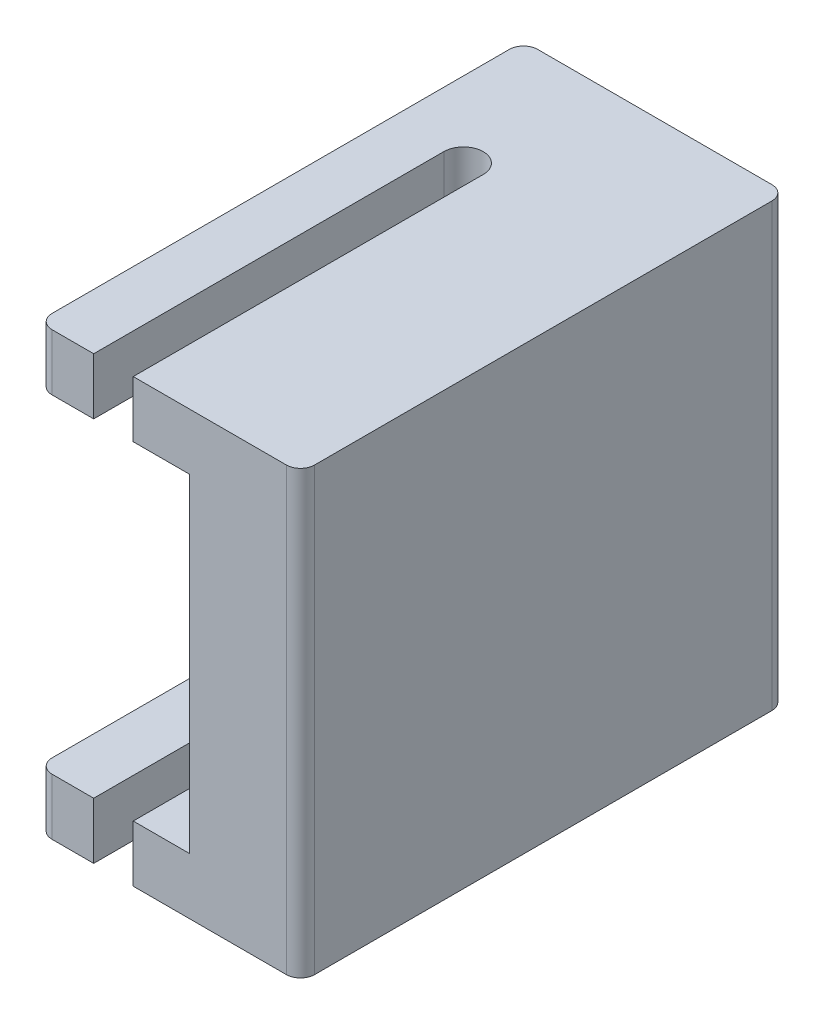
ISO-10303-21;
HEADER;
FILE_DESCRIPTION(('STEP AP214'),'2;1');
FILE_NAME('part.step','',(''),(''),'','','');
FILE_SCHEMA(('AUTOMOTIVE_DESIGN { 1 0 10303 214 1 1 1 1 }'));
ENDSEC;
DATA;
#1=APPLICATION_CONTEXT('core data for automotive mechanical design processes');
#2=APPLICATION_PROTOCOL_DEFINITION('international standard','automotive_design',2000,#1);
#3=PRODUCT_CONTEXT('',#1,'mechanical');
#4=PRODUCT('Part','Part','',(#3));
#5=PRODUCT_RELATED_PRODUCT_CATEGORY('part','',(#4));
#6=PRODUCT_DEFINITION_FORMATION('','',#4);
#7=PRODUCT_DEFINITION_CONTEXT('part definition',#1,'design');
#8=PRODUCT_DEFINITION('design','',#6,#7);
#9=PRODUCT_DEFINITION_SHAPE('','',#8);
#10=(LENGTH_UNIT() NAMED_UNIT(*) SI_UNIT(.MILLI.,.METRE.));
#11=(NAMED_UNIT(*) PLANE_ANGLE_UNIT() SI_UNIT($,.RADIAN.));
#12=(NAMED_UNIT(*) SI_UNIT($,.STERADIAN.) SOLID_ANGLE_UNIT());
#13=UNCERTAINTY_MEASURE_WITH_UNIT(LENGTH_MEASURE(1.E-05),#10,'distance_accuracy_value','');
#14=(GEOMETRIC_REPRESENTATION_CONTEXT(3) GLOBAL_UNCERTAINTY_ASSIGNED_CONTEXT((#13)) GLOBAL_UNIT_ASSIGNED_CONTEXT((#10,
#11,#12)) REPRESENTATION_CONTEXT('',''));
#15=CARTESIAN_POINT('',(0.,0.,0.));
#16=DIRECTION('',(0.,0.,1.));
#17=DIRECTION('',(1.,0.,0.));
#18=AXIS2_PLACEMENT_3D('',#15,#16,#17);
#19=CARTESIAN_POINT('',(0.,0.,43.));
#20=DIRECTION('',(0.,0.,1.));
#21=DIRECTION('',(1.,0.,0.));
#22=AXIS2_PLACEMENT_3D('',#19,#20,#21);
#23=PLANE('',#22);
#24=DIRECTION('',(-1.,0.,0.));
#25=VECTOR('',#24,1.);
#26=CARTESIAN_POINT('',(-19.625,-29.0875,43.));
#27=LINE('',#26,#25);
#28=CARTESIAN_POINT('',(-36.625,-29.0875,43.));
#29=VERTEX_POINT('',#28);
#30=CARTESIAN_POINT('',(-44.,-29.0875,43.));
#31=VERTEX_POINT('',#30);
#32=EDGE_CURVE('E260',#29,#31,#27,.T.);
#33=ORIENTED_EDGE('',*,*,#32,.T.);
#34=DIRECTION('',(0.,-1.,0.));
#35=VECTOR('',#34,1.);
#36=CARTESIAN_POINT('',(-44.,-39.0875,43.));
#37=LINE('',#36,#35);
#38=CARTESIAN_POINT('',(-44.,-39.0875,43.));
#39=VERTEX_POINT('',#38);
#40=EDGE_CURVE('E330',#31,#39,#37,.T.);
#41=ORIENTED_EDGE('',*,*,#40,.T.);
#42=DIRECTION('',(1.,0.,0.));
#43=VECTOR('',#42,1.);
#44=CARTESIAN_POINT('',(-46.5,-39.0875,43.));
#45=LINE('',#44,#43);
#46=CARTESIAN_POINT('',(-36.625,-39.0875,43.));
#47=VERTEX_POINT('',#46);
#48=EDGE_CURVE('E264',#39,#47,#45,.T.);
#49=ORIENTED_EDGE('',*,*,#48,.T.);
#50=DIRECTION('',(0.,1.,0.));
#51=VECTOR('',#50,1.);
#52=CARTESIAN_POINT('',(-36.625,-39.0875,43.));
#53=LINE('',#52,#51);
#54=EDGE_CURVE('E231',#47,#29,#53,.T.);
#55=ORIENTED_EDGE('',*,*,#54,.T.);
#56=EDGE_LOOP('',(#33,#41,#49,#55));
#57=FACE_BOUND('',#56,.T.);
#58=ADVANCED_FACE('F42',(#57),#23,.T.);
#59=DIRECTION('',(-1.,0.,0.));
#60=VECTOR('',#59,1.);
#61=CARTESIAN_POINT('',(0.,39.0875,43.));
#62=LINE('',#61,#60);
#63=CARTESIAN_POINT('',(-36.625,39.0875,43.));
#64=VERTEX_POINT('',#63);
#65=CARTESIAN_POINT('',(-44.,39.0875,43.));
#66=VERTEX_POINT('',#65);
#67=EDGE_CURVE('E255',#64,#66,#62,.T.);
#68=ORIENTED_EDGE('',*,*,#67,.T.);
#69=DIRECTION('',(0.,-1.,0.));
#70=VECTOR('',#69,1.);
#71=CARTESIAN_POINT('',(-44.,29.0875,43.));
#72=LINE('',#71,#70);
#73=CARTESIAN_POINT('',(-44.,29.0875,43.));
#74=VERTEX_POINT('',#73);
#75=EDGE_CURVE('E11',#66,#74,#72,.T.);
#76=ORIENTED_EDGE('',*,*,#75,.T.);
#77=DIRECTION('',(1.,0.,0.));
#78=VECTOR('',#77,1.);
#79=CARTESIAN_POINT('',(-46.5,29.0875,43.));
#80=LINE('',#79,#78);
#81=CARTESIAN_POINT('',(-36.625,29.0875,43.));
#82=VERTEX_POINT('',#81);
#83=EDGE_CURVE('E256',#74,#82,#80,.T.);
#84=ORIENTED_EDGE('',*,*,#83,.T.);
#85=DIRECTION('',(0.,-1.,0.));
#86=VECTOR('',#85,1.);
#87=CARTESIAN_POINT('',(-36.625,0.,43.));
#88=LINE('',#87,#86);
#89=EDGE_CURVE('E304',#64,#82,#88,.T.);
#90=ORIENTED_EDGE('',*,*,#89,.F.);
#91=EDGE_LOOP('',(#68,#76,#84,#90));
#92=FACE_BOUND('',#91,.T.);
#93=ADVANCED_FACE('F425',(#92),#23,.T.);
#94=CARTESIAN_POINT('',(0.,39.0875,43.));
#95=DIRECTION('',(0.,-1.,0.));
#96=DIRECTION('',(1.,0.,0.));
#97=AXIS2_PLACEMENT_3D('',#94,#95,#96);
#98=PLANE('',#97);
#99=DIRECTION('',(0.,0.,-1.));
#100=VECTOR('',#99,1.);
#101=CARTESIAN_POINT('',(0.,39.0875,43.));
#102=LINE('',#101,#100);
#103=CARTESIAN_POINT('',(0.,39.0875,40.5));
#104=VERTEX_POINT('',#103);
#105=CARTESIAN_POINT('',(0.,39.0875,-40.5));
#106=VERTEX_POINT('',#105);
#107=EDGE_CURVE('E266',#104,#106,#102,.T.);
#108=ORIENTED_EDGE('',*,*,#107,.T.);
#109=CARTESIAN_POINT('',(-2.50000000000001,39.0875,-40.5));
#110=DIRECTION('',(0.,-1.,0.));
#111=DIRECTION('',(1.,0.,0.));
#112=AXIS2_PLACEMENT_3D('',#109,#110,#111);
#113=CIRCLE('',#112,2.5);
#114=CARTESIAN_POINT('',(-2.50000000000001,39.0875,-43.));
#115=VERTEX_POINT('',#114);
#116=EDGE_CURVE('E344',#106,#115,#113,.F.);
#117=ORIENTED_EDGE('',*,*,#116,.T.);
#118=DIRECTION('',(-1.,0.,0.));
#119=VECTOR('',#118,1.);
#120=CARTESIAN_POINT('',(0.,39.0875,-43.));
#121=LINE('',#120,#119);
#122=CARTESIAN_POINT('',(-44.,39.0875,-43.));
#123=VERTEX_POINT('',#122);
#124=EDGE_CURVE('E251',#115,#123,#121,.T.);
#125=ORIENTED_EDGE('',*,*,#124,.T.);
#126=CARTESIAN_POINT('',(-44.,39.0875,-40.5));
#127=DIRECTION('',(0.,-1.,0.));
#128=DIRECTION('',(1.,0.,0.));
#129=AXIS2_PLACEMENT_3D('',#126,#127,#128);
#130=CIRCLE('',#129,2.5);
#131=CARTESIAN_POINT('',(-46.5,39.0875,-40.5));
#132=VERTEX_POINT('',#131);
#133=EDGE_CURVE('E342',#123,#132,#130,.F.);
#134=ORIENTED_EDGE('',*,*,#133,.T.);
#135=DIRECTION('',(0.,0.,-1.));
#136=VECTOR('',#135,1.);
#137=CARTESIAN_POINT('',(-46.5,39.0875,43.));
#138=LINE('',#137,#136);
#139=CARTESIAN_POINT('',(-46.5,39.0875,40.5));
#140=VERTEX_POINT('',#139);
#141=EDGE_CURVE('E298',#140,#132,#138,.T.);
#142=ORIENTED_EDGE('',*,*,#141,.F.);
#143=CARTESIAN_POINT('',(-44.,39.0875,40.5));
#144=DIRECTION('',(0.,-1.,0.));
#145=DIRECTION('',(1.,0.,0.));
#146=AXIS2_PLACEMENT_3D('',#143,#144,#145);
#147=CIRCLE('',#146,2.5);
#148=EDGE_CURVE('E338',#140,#66,#147,.F.);
#149=ORIENTED_EDGE('',*,*,#148,.T.);
#150=ORIENTED_EDGE('',*,*,#67,.F.);
#151=DIRECTION('',(0.,0.,1.));
#152=VECTOR('',#151,1.);
#153=CARTESIAN_POINT('',(-36.625,39.0875,43.));
#154=LINE('',#153,#152);
#155=CARTESIAN_POINT('',(-36.625,39.0875,-19.));
#156=VERTEX_POINT('',#155);
#157=EDGE_CURVE('E219',#156,#64,#154,.T.);
#158=ORIENTED_EDGE('',*,*,#157,.F.);
#159=CARTESIAN_POINT('',(-33.125,39.0875,-19.));
#160=DIRECTION('',(0.,1.,0.));
#161=DIRECTION('',(1.,0.,0.));
#162=AXIS2_PLACEMENT_3D('',#159,#160,#161);
#163=CIRCLE('',#162,3.5);
#164=CARTESIAN_POINT('',(-29.625,39.0875,-19.));
#165=VERTEX_POINT('',#164);
#166=EDGE_CURVE('E221',#165,#156,#163,.T.);
#167=ORIENTED_EDGE('',*,*,#166,.F.);
#168=DIRECTION('',(0.,0.,-1.));
#169=VECTOR('',#168,1.);
#170=CARTESIAN_POINT('',(-29.625,39.0875,-19.));
#171=LINE('',#170,#169);
#172=CARTESIAN_POINT('',(-29.625,39.0875,43.));
#173=VERTEX_POINT('',#172);
#174=EDGE_CURVE('E226',#173,#165,#171,.T.);
#175=ORIENTED_EDGE('',*,*,#174,.F.);
#176=CARTESIAN_POINT('',(-2.50000000000001,39.0875,43.));
#177=VERTEX_POINT('',#176);
#178=EDGE_CURVE('E252',#177,#173,#62,.T.);
#179=ORIENTED_EDGE('',*,*,#178,.F.);
#180=CARTESIAN_POINT('',(-2.50000000000001,39.0875,40.5));
#181=DIRECTION('',(0.,-1.,0.));
#182=DIRECTION('',(1.,0.,0.));
#183=AXIS2_PLACEMENT_3D('',#180,#181,#182);
#184=CIRCLE('',#183,2.5);
#185=EDGE_CURVE('E340',#177,#104,#184,.F.);
#186=ORIENTED_EDGE('',*,*,#185,.T.);
#187=EDGE_LOOP('',(#108,#117,#125,#134,#142,#149,#150,#158,#167,#175,#179,#186));
#188=FACE_BOUND('',#187,.T.);
#189=ADVANCED_FACE('F361',(#188),#98,.F.);
#190=CARTESIAN_POINT('',(-46.5,39.0875,43.));
#191=DIRECTION('',(1.,0.,0.));
#192=DIRECTION('',(0.,0.,-1.));
#193=AXIS2_PLACEMENT_3D('',#190,#191,#192);
#194=PLANE('',#193);
#195=ORIENTED_EDGE('',*,*,#141,.T.);
#196=DIRECTION('',(0.,-1.,0.));
#197=VECTOR('',#196,1.);
#198=CARTESIAN_POINT('',(-46.5,39.0875,-40.5));
#199=LINE('',#198,#197);
#200=CARTESIAN_POINT('',(-46.5,29.0875,-40.5));
#201=VERTEX_POINT('',#200);
#202=EDGE_CURVE('E348',#132,#201,#199,.T.);
#203=ORIENTED_EDGE('',*,*,#202,.T.);
#204=DIRECTION('',(0.,0.,-1.));
#205=VECTOR('',#204,1.);
#206=CARTESIAN_POINT('',(-46.5,29.0875,43.));
#207=LINE('',#206,#205);
#208=CARTESIAN_POINT('',(-46.5,29.0875,40.5));
#209=VERTEX_POINT('',#208);
#210=EDGE_CURVE('E295',#209,#201,#207,.T.);
#211=ORIENTED_EDGE('',*,*,#210,.F.);
#212=DIRECTION('',(0.,-1.,0.));
#213=VECTOR('',#212,1.);
#214=CARTESIAN_POINT('',(-46.5,39.0875,40.5));
#215=LINE('',#214,#213);
#216=EDGE_CURVE('E346',#209,#140,#215,.F.);
#217=ORIENTED_EDGE('',*,*,#216,.T.);
#218=EDGE_LOOP('',(#195,#203,#211,#217));
#219=FACE_BOUND('',#218,.T.);
#220=ADVANCED_FACE('F454',(#219),#194,.F.);
#221=CARTESIAN_POINT('',(-46.5,29.0875,43.));
#222=DIRECTION('',(0.,1.,0.));
#223=DIRECTION('',(0.,0.,1.));
#224=AXIS2_PLACEMENT_3D('',#221,#222,#223);
#225=PLANE('',#224);
#226=ORIENTED_EDGE('',*,*,#210,.T.);
#227=CARTESIAN_POINT('',(-44.,29.0875,-40.5));
#228=DIRECTION('',(0.,1.,0.));
#229=DIRECTION('',(0.,0.,1.));
#230=AXIS2_PLACEMENT_3D('',#227,#228,#229);
#231=CIRCLE('',#230,2.5);
#232=CARTESIAN_POINT('',(-44.,29.0875,-43.));
#233=VERTEX_POINT('',#232);
#234=EDGE_CURVE('E64',#201,#233,#231,.F.);
#235=ORIENTED_EDGE('',*,*,#234,.T.);
#236=DIRECTION('',(1.,0.,0.));
#237=VECTOR('',#236,1.);
#238=CARTESIAN_POINT('',(-46.5,29.0875,-43.));
#239=LINE('',#238,#237);
#240=CARTESIAN_POINT('',(-19.625,29.0875,-43.));
#241=VERTEX_POINT('',#240);
#242=EDGE_CURVE('E269',#233,#241,#239,.T.);
#243=ORIENTED_EDGE('',*,*,#242,.T.);
#244=DIRECTION('',(0.,0.,-1.));
#245=VECTOR('',#244,1.);
#246=CARTESIAN_POINT('',(-19.625,29.0875,43.));
#247=LINE('',#246,#245);
#248=CARTESIAN_POINT('',(-19.625,29.0875,43.));
#249=VERTEX_POINT('',#248);
#250=EDGE_CURVE('E292',#249,#241,#247,.T.);
#251=ORIENTED_EDGE('',*,*,#250,.F.);
#252=CARTESIAN_POINT('',(-29.625,29.0875,43.));
#253=VERTEX_POINT('',#252);
#254=EDGE_CURVE('E254',#253,#249,#80,.T.);
#255=ORIENTED_EDGE('',*,*,#254,.F.);
#256=DIRECTION('',(0.,0.,-1.));
#257=VECTOR('',#256,1.);
#258=CARTESIAN_POINT('',(-29.625,29.0875,43.));
#259=LINE('',#258,#257);
#260=CARTESIAN_POINT('',(-29.625,29.0875,-19.));
#261=VERTEX_POINT('',#260);
#262=EDGE_CURVE('E237',#253,#261,#259,.T.);
#263=ORIENTED_EDGE('',*,*,#262,.T.);
#264=CARTESIAN_POINT('',(-33.125,29.0875,-19.));
#265=DIRECTION('',(0.,1.,0.));
#266=DIRECTION('',(0.,0.,1.));
#267=AXIS2_PLACEMENT_3D('',#264,#265,#266);
#268=CIRCLE('',#267,3.5);
#269=CARTESIAN_POINT('',(-36.625,29.0875,-19.));
#270=VERTEX_POINT('',#269);
#271=EDGE_CURVE('E248',#261,#270,#268,.T.);
#272=ORIENTED_EDGE('',*,*,#271,.T.);
#273=DIRECTION('',(0.,0.,1.));
#274=VECTOR('',#273,1.);
#275=CARTESIAN_POINT('',(-36.625,29.0875,43.));
#276=LINE('',#275,#274);
#277=EDGE_CURVE('E243',#270,#82,#276,.T.);
#278=ORIENTED_EDGE('',*,*,#277,.T.);
#279=ORIENTED_EDGE('',*,*,#83,.F.);
#280=CARTESIAN_POINT('',(-44.,29.0875,40.5));
#281=DIRECTION('',(0.,1.,0.));
#282=DIRECTION('',(0.,0.,1.));
#283=AXIS2_PLACEMENT_3D('',#280,#281,#282);
#284=CIRCLE('',#283,2.5);
#285=EDGE_CURVE('E57',#74,#209,#284,.F.);
#286=ORIENTED_EDGE('',*,*,#285,.T.);
#287=EDGE_LOOP('',(#226,#235,#243,#251,#255,#263,#272,#278,#279,#286));
#288=FACE_BOUND('',#287,.T.);
#289=ADVANCED_FACE('F371',(#288),#225,.F.);
#290=CARTESIAN_POINT('',(-19.625,29.0875,43.));
#291=DIRECTION('',(1.,0.,0.));
#292=DIRECTION('',(0.,1.,0.));
#293=AXIS2_PLACEMENT_3D('',#290,#291,#292);
#294=PLANE('',#293);
#295=DIRECTION('',(0.,-1.,0.));
#296=VECTOR('',#295,1.);
#297=CARTESIAN_POINT('',(-19.625,29.0875,-43.));
#298=LINE('',#297,#296);
#299=CARTESIAN_POINT('',(-19.625,-29.0875,-43.));
#300=VERTEX_POINT('',#299);
#301=EDGE_CURVE('E271',#241,#300,#298,.T.);
#302=ORIENTED_EDGE('',*,*,#301,.T.);
#303=DIRECTION('',(0.,0.,-1.));
#304=VECTOR('',#303,1.);
#305=CARTESIAN_POINT('',(-19.625,-29.0875,43.));
#306=LINE('',#305,#304);
#307=CARTESIAN_POINT('',(-19.625,-29.0875,43.));
#308=VERTEX_POINT('',#307);
#309=EDGE_CURVE('E289',#308,#300,#306,.T.);
#310=ORIENTED_EDGE('',*,*,#309,.F.);
#311=DIRECTION('',(0.,-1.,0.));
#312=VECTOR('',#311,1.);
#313=CARTESIAN_POINT('',(-19.625,29.0875,43.));
#314=LINE('',#313,#312);
#315=EDGE_CURVE('E258',#249,#308,#314,.T.);
#316=ORIENTED_EDGE('',*,*,#315,.F.);
#317=ORIENTED_EDGE('',*,*,#250,.T.);
#318=EDGE_LOOP('',(#302,#310,#316,#317));
#319=FACE_BOUND('',#318,.T.);
#320=ADVANCED_FACE('F377',(#319),#294,.F.);
#321=CARTESIAN_POINT('',(-19.625,-29.0875,43.));
#322=DIRECTION('',(0.,-1.,0.));
#323=DIRECTION('',(1.,0.,0.));
#324=AXIS2_PLACEMENT_3D('',#321,#322,#323);
#325=PLANE('',#324);
#326=DIRECTION('',(-1.,0.,0.));
#327=VECTOR('',#326,1.);
#328=CARTESIAN_POINT('',(-19.625,-29.0875,-43.));
#329=LINE('',#328,#327);
#330=CARTESIAN_POINT('',(-44.,-29.0875,-43.));
#331=VERTEX_POINT('',#330);
#332=EDGE_CURVE('E273',#300,#331,#329,.T.);
#333=ORIENTED_EDGE('',*,*,#332,.T.);
#334=CARTESIAN_POINT('',(-44.,-29.0875,-40.5));
#335=DIRECTION('',(0.,-1.,0.));
#336=DIRECTION('',(1.,0.,0.));
#337=AXIS2_PLACEMENT_3D('',#334,#335,#336);
#338=CIRCLE('',#337,2.5);
#339=CARTESIAN_POINT('',(-46.5,-29.0875,-40.5));
#340=VERTEX_POINT('',#339);
#341=EDGE_CURVE('E328',#331,#340,#338,.F.);
#342=ORIENTED_EDGE('',*,*,#341,.T.);
#343=DIRECTION('',(0.,0.,-1.));
#344=VECTOR('',#343,1.);
#345=CARTESIAN_POINT('',(-46.5,-29.0875,43.));
#346=LINE('',#345,#344);
#347=CARTESIAN_POINT('',(-46.5,-29.0875,40.5));
#348=VERTEX_POINT('',#347);
#349=EDGE_CURVE('E286',#348,#340,#346,.T.);
#350=ORIENTED_EDGE('',*,*,#349,.F.);
#351=CARTESIAN_POINT('',(-44.,-29.0875,40.5));
#352=DIRECTION('',(0.,-1.,0.));
#353=DIRECTION('',(1.,0.,0.));
#354=AXIS2_PLACEMENT_3D('',#351,#352,#353);
#355=CIRCLE('',#354,2.5);
#356=EDGE_CURVE('E326',#348,#31,#355,.F.);
#357=ORIENTED_EDGE('',*,*,#356,.T.);
#358=ORIENTED_EDGE('',*,*,#32,.F.);
#359=DIRECTION('',(0.,0.,-1.));
#360=VECTOR('',#359,1.);
#361=CARTESIAN_POINT('',(-36.625,-29.0875,43.));
#362=LINE('',#361,#360);
#363=CARTESIAN_POINT('',(-36.625,-29.0875,-19.));
#364=VERTEX_POINT('',#363);
#365=EDGE_CURVE('E240',#29,#364,#362,.T.);
#366=ORIENTED_EDGE('',*,*,#365,.T.);
#367=CARTESIAN_POINT('',(-33.125,-29.0875,-19.));
#368=DIRECTION('',(0.,-1.,0.));
#369=DIRECTION('',(1.,0.,0.));
#370=AXIS2_PLACEMENT_3D('',#367,#368,#369);
#371=CIRCLE('',#370,3.5);
#372=CARTESIAN_POINT('',(-29.625,-29.0875,-19.));
#373=VERTEX_POINT('',#372);
#374=EDGE_CURVE('E246',#364,#373,#371,.T.);
#375=ORIENTED_EDGE('',*,*,#374,.T.);
#376=DIRECTION('',(0.,0.,1.));
#377=VECTOR('',#376,1.);
#378=CARTESIAN_POINT('',(-29.625,-29.0875,43.));
#379=LINE('',#378,#377);
#380=CARTESIAN_POINT('',(-29.625,-29.0875,43.));
#381=VERTEX_POINT('',#380);
#382=EDGE_CURVE('E198',#373,#381,#379,.T.);
#383=ORIENTED_EDGE('',*,*,#382,.T.);
#384=EDGE_CURVE('E261',#308,#381,#27,.T.);
#385=ORIENTED_EDGE('',*,*,#384,.F.);
#386=ORIENTED_EDGE('',*,*,#309,.T.);
#387=EDGE_LOOP('',(#333,#342,#350,#357,#358,#366,#375,#383,#385,#386));
#388=FACE_BOUND('',#387,.T.);
#389=ADVANCED_FACE('F380',(#388),#325,.F.);
#390=CARTESIAN_POINT('',(-46.5,-29.0875,43.));
#391=DIRECTION('',(1.,0.,0.));
#392=DIRECTION('',(0.,0.,-1.));
#393=AXIS2_PLACEMENT_3D('',#390,#391,#392);
#394=PLANE('',#393);
#395=ORIENTED_EDGE('',*,*,#349,.T.);
#396=DIRECTION('',(0.,-1.,0.));
#397=VECTOR('',#396,1.);
#398=CARTESIAN_POINT('',(-46.5,-29.0875,-40.5));
#399=LINE('',#398,#397);
#400=CARTESIAN_POINT('',(-46.5,-39.0875,-40.5));
#401=VERTEX_POINT('',#400);
#402=EDGE_CURVE('E309',#340,#401,#399,.T.);
#403=ORIENTED_EDGE('',*,*,#402,.T.);
#404=DIRECTION('',(0.,0.,-1.));
#405=VECTOR('',#404,1.);
#406=CARTESIAN_POINT('',(-46.5,-39.0875,43.));
#407=LINE('',#406,#405);
#408=CARTESIAN_POINT('',(-46.5,-39.0875,40.5));
#409=VERTEX_POINT('',#408);
#410=EDGE_CURVE('E284',#409,#401,#407,.T.);
#411=ORIENTED_EDGE('',*,*,#410,.F.);
#412=DIRECTION('',(0.,-1.,0.));
#413=VECTOR('',#412,1.);
#414=CARTESIAN_POINT('',(-46.5,-29.0875,40.5));
#415=LINE('',#414,#413);
#416=EDGE_CURVE('E307',#409,#348,#415,.F.);
#417=ORIENTED_EDGE('',*,*,#416,.T.);
#418=EDGE_LOOP('',(#395,#403,#411,#417));
#419=FACE_BOUND('',#418,.T.);
#420=ADVANCED_FACE('F397',(#419),#394,.F.);
#421=CARTESIAN_POINT('',(-46.5,-39.0875,43.));
#422=DIRECTION('',(0.,1.,0.));
#423=DIRECTION('',(-1.,0.,0.));
#424=AXIS2_PLACEMENT_3D('',#421,#422,#423);
#425=PLANE('',#424);
#426=ORIENTED_EDGE('',*,*,#410,.T.);
#427=CARTESIAN_POINT('',(-44.,-39.0875,-40.5));
#428=DIRECTION('',(0.,1.,0.));
#429=DIRECTION('',(-1.,0.,0.));
#430=AXIS2_PLACEMENT_3D('',#427,#428,#429);
#431=CIRCLE('',#430,2.5);
#432=CARTESIAN_POINT('',(-44.,-39.0875,-43.));
#433=VERTEX_POINT('',#432);
#434=EDGE_CURVE('E318',#401,#433,#431,.F.);
#435=ORIENTED_EDGE('',*,*,#434,.T.);
#436=DIRECTION('',(1.,0.,0.));
#437=VECTOR('',#436,1.);
#438=CARTESIAN_POINT('',(-46.5,-39.0875,-43.));
#439=LINE('',#438,#437);
#440=CARTESIAN_POINT('',(-2.50000000000002,-39.0875,-43.));
#441=VERTEX_POINT('',#440);
#442=EDGE_CURVE('E276',#433,#441,#439,.T.);
#443=ORIENTED_EDGE('',*,*,#442,.T.);
#444=CARTESIAN_POINT('',(-2.5,-39.0875,-40.5));
#445=DIRECTION('',(0.,1.,0.));
#446=DIRECTION('',(-1.,0.,0.));
#447=AXIS2_PLACEMENT_3D('',#444,#445,#446);
#448=CIRCLE('',#447,2.5);
#449=CARTESIAN_POINT('',(0.,-39.0875,-40.5));
#450=VERTEX_POINT('',#449);
#451=EDGE_CURVE('E314',#441,#450,#448,.F.);
#452=ORIENTED_EDGE('',*,*,#451,.T.);
#453=DIRECTION('',(0.,0.,-1.));
#454=VECTOR('',#453,1.);
#455=CARTESIAN_POINT('',(0.,-39.0875,43.));
#456=LINE('',#455,#454);
#457=CARTESIAN_POINT('',(0.,-39.0875,40.5));
#458=VERTEX_POINT('',#457);
#459=EDGE_CURVE('E281',#458,#450,#456,.T.);
#460=ORIENTED_EDGE('',*,*,#459,.F.);
#461=CARTESIAN_POINT('',(-2.5,-39.0875,40.5));
#462=DIRECTION('',(0.,1.,0.));
#463=DIRECTION('',(-1.,0.,0.));
#464=AXIS2_PLACEMENT_3D('',#461,#462,#463);
#465=CIRCLE('',#464,2.5);
#466=CARTESIAN_POINT('',(-2.50000000000002,-39.0875,43.));
#467=VERTEX_POINT('',#466);
#468=EDGE_CURVE('E312',#458,#467,#465,.F.);
#469=ORIENTED_EDGE('',*,*,#468,.T.);
#470=CARTESIAN_POINT('',(-29.625,-39.0875,43.));
#471=VERTEX_POINT('',#470);
#472=EDGE_CURVE('E218',#471,#467,#45,.T.);
#473=ORIENTED_EDGE('',*,*,#472,.F.);
#474=DIRECTION('',(0.,0.,-1.));
#475=VECTOR('',#474,1.);
#476=CARTESIAN_POINT('',(-29.625,-39.0875,-19.));
#477=LINE('',#476,#475);
#478=CARTESIAN_POINT('',(-29.625,-39.0875,-19.));
#479=VERTEX_POINT('',#478);
#480=EDGE_CURVE('E195',#471,#479,#477,.T.);
#481=ORIENTED_EDGE('',*,*,#480,.T.);
#482=CARTESIAN_POINT('',(-33.125,-39.0875,-19.));
#483=DIRECTION('',(0.,1.,0.));
#484=DIRECTION('',(1.,0.,0.));
#485=AXIS2_PLACEMENT_3D('',#482,#483,#484);
#486=CIRCLE('',#485,3.5);
#487=CARTESIAN_POINT('',(-36.625,-39.0875,-19.));
#488=VERTEX_POINT('',#487);
#489=EDGE_CURVE('E205',#479,#488,#486,.T.);
#490=ORIENTED_EDGE('',*,*,#489,.T.);
#491=DIRECTION('',(0.,0.,1.));
#492=VECTOR('',#491,1.);
#493=CARTESIAN_POINT('',(-36.625,-39.0875,43.));
#494=LINE('',#493,#492);
#495=EDGE_CURVE('E212',#488,#47,#494,.T.);
#496=ORIENTED_EDGE('',*,*,#495,.T.);
#497=ORIENTED_EDGE('',*,*,#48,.F.);
#498=CARTESIAN_POINT('',(-44.,-39.0875,40.5));
#499=DIRECTION('',(0.,1.,0.));
#500=DIRECTION('',(-1.,0.,0.));
#501=AXIS2_PLACEMENT_3D('',#498,#499,#500);
#502=CIRCLE('',#501,2.5);
#503=EDGE_CURVE('E316',#39,#409,#502,.F.);
#504=ORIENTED_EDGE('',*,*,#503,.T.);
#505=EDGE_LOOP('',(#426,#435,#443,#452,#460,#469,#473,#481,#490,#496,#497,#504));
#506=FACE_BOUND('',#505,.T.);
#507=ADVANCED_FACE('F216',(#506),#425,.F.);
#508=CARTESIAN_POINT('',(0.,-39.0875,43.));
#509=DIRECTION('',(-1.,0.,0.));
#510=DIRECTION('',(0.,-1.,0.));
#511=AXIS2_PLACEMENT_3D('',#508,#509,#510);
#512=PLANE('',#511);
#513=ORIENTED_EDGE('',*,*,#459,.T.);
#514=DIRECTION('',(0.,1.,0.));
#515=VECTOR('',#514,1.);
#516=CARTESIAN_POINT('',(0.,-39.0875,-40.5));
#517=LINE('',#516,#515);
#518=EDGE_CURVE('E335',#450,#106,#517,.T.);
#519=ORIENTED_EDGE('',*,*,#518,.T.);
#520=ORIENTED_EDGE('',*,*,#107,.F.);
#521=DIRECTION('',(0.,1.,0.));
#522=VECTOR('',#521,1.);
#523=CARTESIAN_POINT('',(0.,-39.0875,40.5));
#524=LINE('',#523,#522);
#525=EDGE_CURVE('E333',#104,#458,#524,.F.);
#526=ORIENTED_EDGE('',*,*,#525,.T.);
#527=EDGE_LOOP('',(#513,#519,#520,#526));
#528=FACE_BOUND('',#527,.T.);
#529=ADVANCED_FACE('F414',(#528),#512,.F.);
#530=ORIENTED_EDGE('',*,*,#472,.T.);
#531=DIRECTION('',(0.,1.,0.));
#532=VECTOR('',#531,1.);
#533=CARTESIAN_POINT('',(-2.50000000000001,39.0875,43.));
#534=LINE('',#533,#532);
#535=EDGE_CURVE('E50',#467,#177,#534,.T.);
#536=ORIENTED_EDGE('',*,*,#535,.T.);
#537=ORIENTED_EDGE('',*,*,#178,.T.);
#538=DIRECTION('',(0.,1.,0.));
#539=VECTOR('',#538,1.);
#540=CARTESIAN_POINT('',(-29.625,0.,43.));
#541=LINE('',#540,#539);
#542=EDGE_CURVE('E301',#253,#173,#541,.T.);
#543=ORIENTED_EDGE('',*,*,#542,.F.);
#544=ORIENTED_EDGE('',*,*,#254,.T.);
#545=ORIENTED_EDGE('',*,*,#315,.T.);
#546=ORIENTED_EDGE('',*,*,#384,.T.);
#547=DIRECTION('',(0.,1.,0.));
#548=VECTOR('',#547,1.);
#549=CARTESIAN_POINT('',(-29.625,-39.0875,43.));
#550=LINE('',#549,#548);
#551=EDGE_CURVE('E225',#471,#381,#550,.T.);
#552=ORIENTED_EDGE('',*,*,#551,.F.);
#553=EDGE_LOOP('',(#530,#536,#537,#543,#544,#545,#546,#552));
#554=FACE_BOUND('',#553,.T.);
#555=ADVANCED_FACE('F355',(#554),#23,.T.);
#556=CARTESIAN_POINT('',(0.,0.,-43.));
#557=DIRECTION('',(0.,0.,1.));
#558=DIRECTION('',(1.,0.,0.));
#559=AXIS2_PLACEMENT_3D('',#556,#557,#558);
#560=PLANE('',#559);
#561=ORIENTED_EDGE('',*,*,#442,.F.);
#562=DIRECTION('',(0.,-1.,0.));
#563=VECTOR('',#562,1.);
#564=CARTESIAN_POINT('',(-44.,0.,-43.));
#565=LINE('',#564,#563);
#566=EDGE_CURVE('E324',#433,#331,#565,.F.);
#567=ORIENTED_EDGE('',*,*,#566,.T.);
#568=ORIENTED_EDGE('',*,*,#332,.F.);
#569=ORIENTED_EDGE('',*,*,#301,.F.);
#570=ORIENTED_EDGE('',*,*,#242,.F.);
#571=DIRECTION('',(0.,-1.,0.));
#572=VECTOR('',#571,1.);
#573=CARTESIAN_POINT('',(-44.,0.,-43.));
#574=LINE('',#573,#572);
#575=EDGE_CURVE('E320',#233,#123,#574,.F.);
#576=ORIENTED_EDGE('',*,*,#575,.T.);
#577=ORIENTED_EDGE('',*,*,#124,.F.);
#578=DIRECTION('',(0.,1.,0.));
#579=VECTOR('',#578,1.);
#580=CARTESIAN_POINT('',(-2.5,0.,-43.));
#581=LINE('',#580,#579);
#582=EDGE_CURVE('E322',#115,#441,#581,.F.);
#583=ORIENTED_EDGE('',*,*,#582,.T.);
#584=EDGE_LOOP('',(#561,#567,#568,#569,#570,#576,#577,#583));
#585=FACE_BOUND('',#584,.T.);
#586=ADVANCED_FACE('F406',(#585),#560,.F.);
#587=CARTESIAN_POINT('',(-36.625,-39.0875,43.));
#588=DIRECTION('',(-1.,0.,0.));
#589=DIRECTION('',(0.,-1.,0.));
#590=AXIS2_PLACEMENT_3D('',#587,#588,#589);
#591=PLANE('',#590);
#592=DIRECTION('',(0.,1.,0.));
#593=VECTOR('',#592,1.);
#594=CARTESIAN_POINT('',(-36.625,-39.0875,-19.));
#595=LINE('',#594,#593);
#596=EDGE_CURVE('E201',#270,#156,#595,.T.);
#597=ORIENTED_EDGE('',*,*,#596,.T.);
#598=ORIENTED_EDGE('',*,*,#157,.T.);
#599=ORIENTED_EDGE('',*,*,#89,.T.);
#600=ORIENTED_EDGE('',*,*,#277,.F.);
#601=EDGE_LOOP('',(#597,#598,#599,#600));
#602=FACE_BOUND('',#601,.T.);
#603=ADVANCED_FACE('F439',(#602),#591,.F.);
#604=CARTESIAN_POINT('',(-29.625,-39.0875,-19.));
#605=DIRECTION('',(1.,0.,0.));
#606=DIRECTION('',(0.,1.,0.));
#607=AXIS2_PLACEMENT_3D('',#604,#605,#606);
#608=PLANE('',#607);
#609=ORIENTED_EDGE('',*,*,#542,.T.);
#610=ORIENTED_EDGE('',*,*,#174,.T.);
#611=DIRECTION('',(0.,1.,0.));
#612=VECTOR('',#611,1.);
#613=CARTESIAN_POINT('',(-29.625,-39.0875,-19.));
#614=LINE('',#613,#612);
#615=EDGE_CURVE('E202',#261,#165,#614,.T.);
#616=ORIENTED_EDGE('',*,*,#615,.F.);
#617=ORIENTED_EDGE('',*,*,#262,.F.);
#618=EDGE_LOOP('',(#609,#610,#616,#617));
#619=FACE_BOUND('',#618,.T.);
#620=ADVANCED_FACE('F367',(#619),#608,.F.);
#621=CARTESIAN_POINT('',(-33.125,-39.0875,-19.));
#622=DIRECTION('',(0.,1.,0.));
#623=DIRECTION('',(-1.,0.,0.));
#624=AXIS2_PLACEMENT_3D('',#621,#622,#623);
#625=CYLINDRICAL_SURFACE('',#624,3.5);
#626=ORIENTED_EDGE('',*,*,#615,.T.);
#627=ORIENTED_EDGE('',*,*,#166,.T.);
#628=ORIENTED_EDGE('',*,*,#596,.F.);
#629=ORIENTED_EDGE('',*,*,#271,.F.);
#630=EDGE_LOOP('',(#626,#627,#628,#629));
#631=FACE_BOUND('',#630,.T.);
#632=ADVANCED_FACE('F515',(#631),#625,.F.);
#633=EDGE_CURVE('E208',#488,#364,#595,.T.);
#634=ORIENTED_EDGE('',*,*,#633,.F.);
#635=ORIENTED_EDGE('',*,*,#489,.F.);
#636=EDGE_CURVE('E191',#479,#373,#614,.T.);
#637=ORIENTED_EDGE('',*,*,#636,.T.);
#638=ORIENTED_EDGE('',*,*,#374,.F.);
#639=EDGE_LOOP('',(#634,#635,#637,#638));
#640=FACE_BOUND('',#639,.T.);
#641=ADVANCED_FACE('F206',(#640),#625,.F.);
#642=ORIENTED_EDGE('',*,*,#54,.F.);
#643=ORIENTED_EDGE('',*,*,#495,.F.);
#644=ORIENTED_EDGE('',*,*,#633,.T.);
#645=ORIENTED_EDGE('',*,*,#365,.F.);
#646=EDGE_LOOP('',(#642,#643,#644,#645));
#647=FACE_BOUND('',#646,.T.);
#648=ADVANCED_FACE('F385',(#647),#591,.F.);
#649=ORIENTED_EDGE('',*,*,#636,.F.);
#650=ORIENTED_EDGE('',*,*,#480,.F.);
#651=ORIENTED_EDGE('',*,*,#551,.T.);
#652=ORIENTED_EDGE('',*,*,#382,.F.);
#653=EDGE_LOOP('',(#649,#650,#651,#652));
#654=FACE_BOUND('',#653,.T.);
#655=ADVANCED_FACE('F193',(#654),#608,.F.);
#656=CARTESIAN_POINT('',(-44.,-29.0875,-40.5));
#657=DIRECTION('',(0.,-1.,0.));
#658=DIRECTION('',(0.,0.,-1.));
#659=AXIS2_PLACEMENT_3D('',#656,#657,#658);
#660=CYLINDRICAL_SURFACE('',#659,2.5);
#661=ORIENTED_EDGE('',*,*,#341,.F.);
#662=ORIENTED_EDGE('',*,*,#566,.F.);
#663=ORIENTED_EDGE('',*,*,#434,.F.);
#664=ORIENTED_EDGE('',*,*,#402,.F.);
#665=EDGE_LOOP('',(#661,#662,#663,#664));
#666=FACE_BOUND('',#665,.T.);
#667=ADVANCED_FACE('F402',(#666),#660,.T.);
#668=CARTESIAN_POINT('',(-44.,0.,40.5));
#669=DIRECTION('',(0.,1.,0.));
#670=DIRECTION('',(0.,0.,1.));
#671=AXIS2_PLACEMENT_3D('',#668,#669,#670);
#672=CYLINDRICAL_SURFACE('',#671,2.5);
#673=ORIENTED_EDGE('',*,*,#356,.F.);
#674=ORIENTED_EDGE('',*,*,#416,.F.);
#675=ORIENTED_EDGE('',*,*,#503,.F.);
#676=ORIENTED_EDGE('',*,*,#40,.F.);
#677=EDGE_LOOP('',(#673,#674,#675,#676));
#678=FACE_BOUND('',#677,.T.);
#679=ADVANCED_FACE('F393',(#678),#672,.T.);
#680=CARTESIAN_POINT('',(-2.5,-39.0875,-40.5));
#681=DIRECTION('',(0.,1.,0.));
#682=DIRECTION('',(-1.,0.,0.));
#683=AXIS2_PLACEMENT_3D('',#680,#681,#682);
#684=CYLINDRICAL_SURFACE('',#683,2.5);
#685=ORIENTED_EDGE('',*,*,#451,.F.);
#686=ORIENTED_EDGE('',*,*,#582,.F.);
#687=ORIENTED_EDGE('',*,*,#116,.F.);
#688=ORIENTED_EDGE('',*,*,#518,.F.);
#689=EDGE_LOOP('',(#685,#686,#687,#688));
#690=FACE_BOUND('',#689,.T.);
#691=ADVANCED_FACE('F410',(#690),#684,.T.);
#692=CARTESIAN_POINT('',(-44.,39.0875,-40.5));
#693=DIRECTION('',(0.,-1.,0.));
#694=DIRECTION('',(0.,0.,-1.));
#695=AXIS2_PLACEMENT_3D('',#692,#693,#694);
#696=CYLINDRICAL_SURFACE('',#695,2.5);
#697=ORIENTED_EDGE('',*,*,#133,.F.);
#698=ORIENTED_EDGE('',*,*,#575,.F.);
#699=ORIENTED_EDGE('',*,*,#234,.F.);
#700=ORIENTED_EDGE('',*,*,#202,.F.);
#701=EDGE_LOOP('',(#697,#698,#699,#700));
#702=FACE_BOUND('',#701,.T.);
#703=ADVANCED_FACE('F418',(#702),#696,.T.);
#704=CARTESIAN_POINT('',(-2.5,0.,40.5));
#705=DIRECTION('',(0.,-1.,0.));
#706=DIRECTION('',(1.,0.,0.));
#707=AXIS2_PLACEMENT_3D('',#704,#705,#706);
#708=CYLINDRICAL_SURFACE('',#707,2.5);
#709=ORIENTED_EDGE('',*,*,#468,.F.);
#710=ORIENTED_EDGE('',*,*,#525,.F.);
#711=ORIENTED_EDGE('',*,*,#185,.F.);
#712=ORIENTED_EDGE('',*,*,#535,.F.);
#713=EDGE_LOOP('',(#709,#710,#711,#712));
#714=FACE_BOUND('',#713,.T.);
#715=ADVANCED_FACE('F416',(#714),#708,.T.);
#716=CARTESIAN_POINT('',(-44.,0.,40.5));
#717=DIRECTION('',(0.,1.,0.));
#718=DIRECTION('',(0.,0.,1.));
#719=AXIS2_PLACEMENT_3D('',#716,#717,#718);
#720=CYLINDRICAL_SURFACE('',#719,2.5);
#721=ORIENTED_EDGE('',*,*,#148,.F.);
#722=ORIENTED_EDGE('',*,*,#216,.F.);
#723=ORIENTED_EDGE('',*,*,#285,.F.);
#724=ORIENTED_EDGE('',*,*,#75,.F.);
#725=EDGE_LOOP('',(#721,#722,#723,#724));
#726=FACE_BOUND('',#725,.T.);
#727=ADVANCED_FACE('F44',(#726),#720,.T.);
#728=CLOSED_SHELL('',(#58,#93,#189,#220,#289,#320,#389,#420,#507,#529,#555,#586,#603,#620,#632,
#641,#648,#655,#667,#679,#691,#703,#715,#727));
#729=MANIFOLD_SOLID_BREP('B2',#728);
#730=ADVANCED_BREP_SHAPE_REPRESENTATION('',(#18,#729),#14);
#731=SHAPE_DEFINITION_REPRESENTATION(#9,#730);
ENDSEC;
END-ISO-10303-21;
